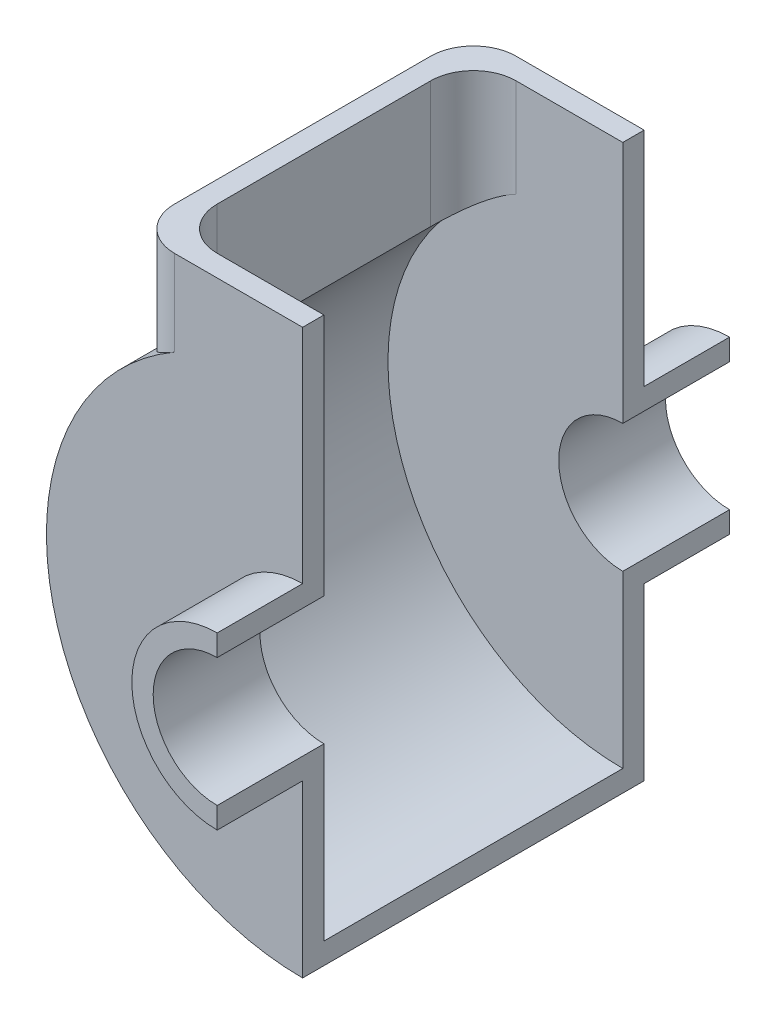
ISO-10303-21;
HEADER;
FILE_DESCRIPTION(('STEP AP214'),'2;1');
FILE_NAME('part.step','',(''),(''),'','','');
FILE_SCHEMA(('AUTOMOTIVE_DESIGN { 1 0 10303 214 1 1 1 1 }'));
ENDSEC;
DATA;
#1=APPLICATION_CONTEXT('core data for automotive mechanical design processes');
#2=APPLICATION_PROTOCOL_DEFINITION('international standard','automotive_design',2000,#1);
#3=PRODUCT_CONTEXT('',#1,'mechanical');
#4=PRODUCT('Part','Part','',(#3));
#5=PRODUCT_RELATED_PRODUCT_CATEGORY('part','',(#4));
#6=PRODUCT_DEFINITION_FORMATION('','',#4);
#7=PRODUCT_DEFINITION_CONTEXT('part definition',#1,'design');
#8=PRODUCT_DEFINITION('design','',#6,#7);
#9=PRODUCT_DEFINITION_SHAPE('','',#8);
#10=(LENGTH_UNIT() NAMED_UNIT(*) SI_UNIT(.MILLI.,.METRE.));
#11=(NAMED_UNIT(*) PLANE_ANGLE_UNIT() SI_UNIT($,.RADIAN.));
#12=(NAMED_UNIT(*) SI_UNIT($,.STERADIAN.) SOLID_ANGLE_UNIT());
#13=UNCERTAINTY_MEASURE_WITH_UNIT(LENGTH_MEASURE(1.E-05),#10,'distance_accuracy_value','');
#14=(GEOMETRIC_REPRESENTATION_CONTEXT(3) GLOBAL_UNCERTAINTY_ASSIGNED_CONTEXT((#13)) GLOBAL_UNIT_ASSIGNED_CONTEXT((#10,
#11,#12)) REPRESENTATION_CONTEXT('',''));
#15=CARTESIAN_POINT('',(0.,0.,0.));
#16=DIRECTION('',(0.,0.,1.));
#17=DIRECTION('',(1.,0.,0.));
#18=AXIS2_PLACEMENT_3D('',#15,#16,#17);
#19=CARTESIAN_POINT('',(0.,0.,0.));
#20=DIRECTION('',(0.,0.,1.));
#21=DIRECTION('',(1.,0.,0.));
#22=AXIS2_PLACEMENT_3D('',#19,#20,#21);
#23=PLANE('',#22);
#24=CARTESIAN_POINT('',(0.,0.,0.));
#25=DIRECTION('',(0.,0.,1.));
#26=DIRECTION('',(1.,0.,0.));
#27=AXIS2_PLACEMENT_3D('',#24,#25,#26);
#28=CIRCLE('',#27,55.);
#29=CARTESIAN_POINT('',(-25.,48.9897948556636,0.));
#30=VERTEX_POINT('',#29);
#31=CARTESIAN_POINT('',(0.,-55.,0.));
#32=VERTEX_POINT('',#31);
#33=EDGE_CURVE('E272',#30,#32,#28,.T.);
#34=ORIENTED_EDGE('',*,*,#33,.F.);
#35=DIRECTION('',(0.,-1.,0.));
#36=VECTOR('',#35,1.);
#37=CARTESIAN_POINT('',(-25.,72.,0.));
#38=LINE('',#37,#36);
#39=CARTESIAN_POINT('',(-25.,72.,0.));
#40=VERTEX_POINT('',#39);
#41=EDGE_CURVE('E366',#30,#40,#38,.F.);
#42=ORIENTED_EDGE('',*,*,#41,.T.);
#43=DIRECTION('',(1.,0.,0.));
#44=VECTOR('',#43,1.);
#45=CARTESIAN_POINT('',(0.,72.,0.));
#46=LINE('',#45,#44);
#47=CARTESIAN_POINT('',(0.,72.,0.));
#48=VERTEX_POINT('',#47);
#49=EDGE_CURVE('E285',#40,#48,#46,.T.);
#50=ORIENTED_EDGE('',*,*,#49,.T.);
#51=DIRECTION('',(0.,1.,0.));
#52=VECTOR('',#51,1.);
#53=CARTESIAN_POINT('',(0.,15.,0.));
#54=LINE('',#53,#52);
#55=CARTESIAN_POINT('',(0.,15.,0.));
#56=VERTEX_POINT('',#55);
#57=EDGE_CURVE('E312',#56,#48,#54,.T.);
#58=ORIENTED_EDGE('',*,*,#57,.F.);
#59=CARTESIAN_POINT('',(0.,0.,0.));
#60=DIRECTION('',(0.,0.,1.));
#61=DIRECTION('',(1.,0.,0.));
#62=AXIS2_PLACEMENT_3D('',#59,#60,#61);
#63=CIRCLE('',#62,15.);
#64=CARTESIAN_POINT('',(0.,-15.,0.));
#65=VERTEX_POINT('',#64);
#66=EDGE_CURVE('E323',#56,#65,#63,.T.);
#67=ORIENTED_EDGE('',*,*,#66,.T.);
#68=DIRECTION('',(0.,-1.,0.));
#69=VECTOR('',#68,1.);
#70=CARTESIAN_POINT('',(0.,-15.,0.));
#71=LINE('',#70,#69);
#72=EDGE_CURVE('E338',#65,#32,#71,.T.);
#73=ORIENTED_EDGE('',*,*,#72,.T.);
#74=EDGE_LOOP('',(#34,#42,#50,#58,#67,#73));
#75=FACE_BOUND('',#74,.T.);
#76=ADVANCED_FACE('F43',(#75),#23,.F.);
#77=CARTESIAN_POINT('',(0.,0.,25.));
#78=DIRECTION('',(0.,0.,-1.));
#79=DIRECTION('',(-1.,0.,0.));
#80=AXIS2_PLACEMENT_3D('',#77,#78,#79);
#81=CYLINDRICAL_SURFACE('',#80,20.);
#82=CARTESIAN_POINT('',(0.,0.,5.));
#83=DIRECTION('',(0.,0.,1.));
#84=DIRECTION('',(-1.,0.,0.));
#85=AXIS2_PLACEMENT_3D('',#82,#83,#84);
#86=CIRCLE('',#85,20.);
#87=CARTESIAN_POINT('',(0.,20.,5.));
#88=VERTEX_POINT('',#87);
#89=CARTESIAN_POINT('',(0.,-20.,5.));
#90=VERTEX_POINT('',#89);
#91=EDGE_CURVE('E293',#88,#90,#86,.T.);
#92=ORIENTED_EDGE('',*,*,#91,.T.);
#93=DIRECTION('',(0.,0.,-1.));
#94=VECTOR('',#93,1.);
#95=CARTESIAN_POINT('',(0.,-20.,25.));
#96=LINE('',#95,#94);
#97=CARTESIAN_POINT('',(0.,-20.,25.));
#98=VERTEX_POINT('',#97);
#99=EDGE_CURVE('E349',#98,#90,#96,.T.);
#100=ORIENTED_EDGE('',*,*,#99,.F.);
#101=CARTESIAN_POINT('',(0.,0.,25.));
#102=DIRECTION('',(0.,0.,1.));
#103=DIRECTION('',(1.,0.,0.));
#104=AXIS2_PLACEMENT_3D('',#101,#102,#103);
#105=CIRCLE('',#104,20.);
#106=CARTESIAN_POINT('',(0.,20.,25.));
#107=VERTEX_POINT('',#106);
#108=EDGE_CURVE('E322',#107,#98,#105,.T.);
#109=ORIENTED_EDGE('',*,*,#108,.F.);
#110=DIRECTION('',(0.,0.,-1.));
#111=VECTOR('',#110,1.);
#112=CARTESIAN_POINT('',(0.,20.,25.));
#113=LINE('',#112,#111);
#114=EDGE_CURVE('E352',#107,#88,#113,.T.);
#115=ORIENTED_EDGE('',*,*,#114,.T.);
#116=EDGE_LOOP('',(#92,#100,#109,#115));
#117=FACE_BOUND('',#116,.T.);
#118=ADVANCED_FACE('F447',(#117),#81,.T.);
#119=CARTESIAN_POINT('',(0.,15.,25.));
#120=DIRECTION('',(-1.,0.,0.));
#121=DIRECTION('',(0.,0.,1.));
#122=AXIS2_PLACEMENT_3D('',#119,#120,#121);
#123=PLANE('',#122);
#124=ORIENTED_EDGE('',*,*,#57,.T.);
#125=DIRECTION('',(0.,0.,-1.));
#126=VECTOR('',#125,1.);
#127=CARTESIAN_POINT('',(0.,72.,5.));
#128=LINE('',#127,#126);
#129=CARTESIAN_POINT('',(0.,72.,5.));
#130=VERTEX_POINT('',#129);
#131=EDGE_CURVE('E308',#130,#48,#128,.T.);
#132=ORIENTED_EDGE('',*,*,#131,.F.);
#133=DIRECTION('',(0.,-1.,0.));
#134=VECTOR('',#133,1.);
#135=CARTESIAN_POINT('',(0.,20.,5.));
#136=LINE('',#135,#134);
#137=EDGE_CURVE('E200',#130,#88,#136,.T.);
#138=ORIENTED_EDGE('',*,*,#137,.T.);
#139=ORIENTED_EDGE('',*,*,#114,.F.);
#140=DIRECTION('',(0.,1.,0.));
#141=VECTOR('',#140,1.);
#142=CARTESIAN_POINT('',(0.,15.,25.));
#143=LINE('',#142,#141);
#144=CARTESIAN_POINT('',(0.,15.,25.));
#145=VERTEX_POINT('',#144);
#146=EDGE_CURVE('E318',#145,#107,#143,.T.);
#147=ORIENTED_EDGE('',*,*,#146,.F.);
#148=DIRECTION('',(0.,0.,-1.));
#149=VECTOR('',#148,1.);
#150=CARTESIAN_POINT('',(0.,15.,25.));
#151=LINE('',#150,#149);
#152=EDGE_CURVE('E334',#145,#56,#151,.T.);
#153=ORIENTED_EDGE('',*,*,#152,.T.);
#154=EDGE_LOOP('',(#124,#132,#138,#139,#147,#153));
#155=FACE_BOUND('',#154,.T.);
#156=ADVANCED_FACE('F409',(#155),#123,.F.);
#157=CARTESIAN_POINT('',(0.,-15.,25.));
#158=DIRECTION('',(1.,0.,0.));
#159=DIRECTION('',(0.,0.,-1.));
#160=AXIS2_PLACEMENT_3D('',#157,#158,#159);
#161=PLANE('',#160);
#162=ORIENTED_EDGE('',*,*,#72,.F.);
#163=DIRECTION('',(0.,0.,-1.));
#164=VECTOR('',#163,1.);
#165=CARTESIAN_POINT('',(0.,-15.,25.));
#166=LINE('',#165,#164);
#167=CARTESIAN_POINT('',(0.,-15.,25.));
#168=VERTEX_POINT('',#167);
#169=EDGE_CURVE('E346',#168,#65,#166,.T.);
#170=ORIENTED_EDGE('',*,*,#169,.F.);
#171=DIRECTION('',(0.,-1.,0.));
#172=VECTOR('',#171,1.);
#173=CARTESIAN_POINT('',(0.,-15.,25.));
#174=LINE('',#173,#172);
#175=EDGE_CURVE('E326',#168,#98,#174,.T.);
#176=ORIENTED_EDGE('',*,*,#175,.T.);
#177=ORIENTED_EDGE('',*,*,#99,.T.);
#178=DIRECTION('',(0.,-1.,0.));
#179=VECTOR('',#178,1.);
#180=CARTESIAN_POINT('',(0.,-20.,5.));
#181=LINE('',#180,#179);
#182=CARTESIAN_POINT('',(0.,-60.,5.));
#183=VERTEX_POINT('',#182);
#184=EDGE_CURVE('E197',#90,#183,#181,.T.);
#185=ORIENTED_EDGE('',*,*,#184,.T.);
#186=DIRECTION('',(0.,0.,-1.));
#187=VECTOR('',#186,1.);
#188=CARTESIAN_POINT('',(0.,-60.,5.));
#189=LINE('',#188,#187);
#190=CARTESIAN_POINT('',(0.,-60.,-75.));
#191=VERTEX_POINT('',#190);
#192=EDGE_CURVE('E187',#183,#191,#189,.T.);
#193=ORIENTED_EDGE('',*,*,#192,.T.);
#194=DIRECTION('',(0.,-1.,0.));
#195=VECTOR('',#194,1.);
#196=CARTESIAN_POINT('',(0.,-20.,-75.));
#197=LINE('',#196,#195);
#198=CARTESIAN_POINT('',(0.,-20.,-75.));
#199=VERTEX_POINT('',#198);
#200=EDGE_CURVE('E193',#199,#191,#197,.T.);
#201=ORIENTED_EDGE('',*,*,#200,.F.);
#202=DIRECTION('',(0.,0.,1.));
#203=VECTOR('',#202,1.);
#204=CARTESIAN_POINT('',(0.,-20.,-95.));
#205=LINE('',#204,#203);
#206=CARTESIAN_POINT('',(0.,-20.,-95.));
#207=VERTEX_POINT('',#206);
#208=EDGE_CURVE('E265',#207,#199,#205,.T.);
#209=ORIENTED_EDGE('',*,*,#208,.F.);
#210=DIRECTION('',(0.,-1.,0.));
#211=VECTOR('',#210,1.);
#212=CARTESIAN_POINT('',(0.,-15.,-95.));
#213=LINE('',#212,#211);
#214=CARTESIAN_POINT('',(0.,-15.,-95.));
#215=VERTEX_POINT('',#214);
#216=EDGE_CURVE('E242',#215,#207,#213,.T.);
#217=ORIENTED_EDGE('',*,*,#216,.F.);
#218=DIRECTION('',(0.,0.,1.));
#219=VECTOR('',#218,1.);
#220=CARTESIAN_POINT('',(0.,-15.,-95.));
#221=LINE('',#220,#219);
#222=CARTESIAN_POINT('',(0.,-15.,-70.));
#223=VERTEX_POINT('',#222);
#224=EDGE_CURVE('E261',#215,#223,#221,.T.);
#225=ORIENTED_EDGE('',*,*,#224,.T.);
#226=DIRECTION('',(0.,-1.,0.));
#227=VECTOR('',#226,1.);
#228=CARTESIAN_POINT('',(0.,-15.,-70.));
#229=LINE('',#228,#227);
#230=CARTESIAN_POINT('',(0.,-55.,-70.));
#231=VERTEX_POINT('',#230);
#232=EDGE_CURVE('E252',#223,#231,#229,.T.);
#233=ORIENTED_EDGE('',*,*,#232,.T.);
#234=DIRECTION('',(0.,0.,1.));
#235=VECTOR('',#234,1.);
#236=CARTESIAN_POINT('',(0.,-55.,-70.));
#237=LINE('',#236,#235);
#238=EDGE_CURVE('E277',#231,#32,#237,.T.);
#239=ORIENTED_EDGE('',*,*,#238,.T.);
#240=EDGE_LOOP('',(#162,#170,#176,#177,#185,#193,#201,#209,#217,#225,#233,#239));
#241=FACE_BOUND('',#240,.T.);
#242=ADVANCED_FACE('F190',(#241),#161,.T.);
#243=CARTESIAN_POINT('',(0.,0.,25.));
#244=DIRECTION('',(0.,0.,-1.));
#245=DIRECTION('',(-1.,0.,0.));
#246=AXIS2_PLACEMENT_3D('',#243,#244,#245);
#247=CYLINDRICAL_SURFACE('',#246,15.);
#248=ORIENTED_EDGE('',*,*,#66,.F.);
#249=ORIENTED_EDGE('',*,*,#152,.F.);
#250=CARTESIAN_POINT('',(0.,0.,25.));
#251=DIRECTION('',(0.,0.,1.));
#252=DIRECTION('',(1.,0.,0.));
#253=AXIS2_PLACEMENT_3D('',#250,#251,#252);
#254=CIRCLE('',#253,15.);
#255=EDGE_CURVE('E330',#145,#168,#254,.T.);
#256=ORIENTED_EDGE('',*,*,#255,.T.);
#257=ORIENTED_EDGE('',*,*,#169,.T.);
#258=EDGE_LOOP('',(#248,#249,#256,#257));
#259=FACE_BOUND('',#258,.T.);
#260=ADVANCED_FACE('F443',(#259),#247,.F.);
#261=CARTESIAN_POINT('',(0.,0.,25.));
#262=DIRECTION('',(0.,0.,1.));
#263=DIRECTION('',(1.,0.,0.));
#264=AXIS2_PLACEMENT_3D('',#261,#262,#263);
#265=PLANE('',#264);
#266=ORIENTED_EDGE('',*,*,#146,.T.);
#267=ORIENTED_EDGE('',*,*,#108,.T.);
#268=ORIENTED_EDGE('',*,*,#175,.F.);
#269=ORIENTED_EDGE('',*,*,#255,.F.);
#270=EDGE_LOOP('',(#266,#267,#268,#269));
#271=FACE_BOUND('',#270,.T.);
#272=ADVANCED_FACE('F438',(#271),#265,.T.);
#273=CARTESIAN_POINT('',(0.,72.,5.));
#274=DIRECTION('',(0.,1.,0.));
#275=DIRECTION('',(0.,0.,1.));
#276=AXIS2_PLACEMENT_3D('',#273,#274,#275);
#277=PLANE('',#276);
#278=DIRECTION('',(1.,0.,0.));
#279=VECTOR('',#278,1.);
#280=CARTESIAN_POINT('',(0.,72.,-75.));
#281=LINE('',#280,#279);
#282=CARTESIAN_POINT('',(-30.,72.,-75.));
#283=VERTEX_POINT('',#282);
#284=CARTESIAN_POINT('',(0.,72.,-75.));
#285=VERTEX_POINT('',#284);
#286=EDGE_CURVE('E210',#283,#285,#281,.T.);
#287=ORIENTED_EDGE('',*,*,#286,.F.);
#288=CARTESIAN_POINT('',(-30.,72.,-65.));
#289=DIRECTION('',(0.,1.,0.));
#290=DIRECTION('',(0.,0.,1.));
#291=AXIS2_PLACEMENT_3D('',#288,#289,#290);
#292=CIRCLE('',#291,10.);
#293=CARTESIAN_POINT('',(-40.,72.,-65.));
#294=VERTEX_POINT('',#293);
#295=EDGE_CURVE('E375',#283,#294,#292,.T.);
#296=ORIENTED_EDGE('',*,*,#295,.T.);
#297=DIRECTION('',(0.,0.,-1.));
#298=VECTOR('',#297,1.);
#299=CARTESIAN_POINT('',(-40.,72.,5.));
#300=LINE('',#299,#298);
#301=CARTESIAN_POINT('',(-40.,72.,-5.));
#302=VERTEX_POINT('',#301);
#303=EDGE_CURVE('E313',#302,#294,#300,.T.);
#304=ORIENTED_EDGE('',*,*,#303,.F.);
#305=CARTESIAN_POINT('',(-30.,72.,-5.));
#306=DIRECTION('',(0.,1.,0.));
#307=DIRECTION('',(0.,0.,1.));
#308=AXIS2_PLACEMENT_3D('',#305,#306,#307);
#309=CIRCLE('',#308,10.);
#310=CARTESIAN_POINT('',(-30.,72.,5.));
#311=VERTEX_POINT('',#310);
#312=EDGE_CURVE('E372',#302,#311,#309,.T.);
#313=ORIENTED_EDGE('',*,*,#312,.T.);
#314=DIRECTION('',(1.,0.,0.));
#315=VECTOR('',#314,1.);
#316=CARTESIAN_POINT('',(0.,72.,5.));
#317=LINE('',#316,#315);
#318=EDGE_CURVE('E300',#311,#130,#317,.T.);
#319=ORIENTED_EDGE('',*,*,#318,.T.);
#320=ORIENTED_EDGE('',*,*,#131,.T.);
#321=ORIENTED_EDGE('',*,*,#49,.F.);
#322=CARTESIAN_POINT('',(-25.,72.,-10.));
#323=DIRECTION('',(0.,1.,0.));
#324=DIRECTION('',(0.,0.,1.));
#325=AXIS2_PLACEMENT_3D('',#322,#323,#324);
#326=CIRCLE('',#325,10.);
#327=CARTESIAN_POINT('',(-35.,72.,-10.));
#328=VERTEX_POINT('',#327);
#329=EDGE_CURVE('E424',#40,#328,#326,.F.);
#330=ORIENTED_EDGE('',*,*,#329,.T.);
#331=DIRECTION('',(0.,0.,1.));
#332=VECTOR('',#331,1.);
#333=CARTESIAN_POINT('',(-35.,72.,-70.));
#334=LINE('',#333,#332);
#335=CARTESIAN_POINT('',(-35.,72.,-60.));
#336=VERTEX_POINT('',#335);
#337=EDGE_CURVE('E281',#336,#328,#334,.T.);
#338=ORIENTED_EDGE('',*,*,#337,.F.);
#339=CARTESIAN_POINT('',(-25.,72.,-60.));
#340=DIRECTION('',(0.,1.,0.));
#341=DIRECTION('',(0.,0.,1.));
#342=AXIS2_PLACEMENT_3D('',#339,#340,#341);
#343=CIRCLE('',#342,10.);
#344=CARTESIAN_POINT('',(-25.,72.,-70.));
#345=VERTEX_POINT('',#344);
#346=EDGE_CURVE('E396',#336,#345,#343,.F.);
#347=ORIENTED_EDGE('',*,*,#346,.T.);
#348=DIRECTION('',(1.,0.,0.));
#349=VECTOR('',#348,1.);
#350=CARTESIAN_POINT('',(0.,72.,-70.));
#351=LINE('',#350,#349);
#352=CARTESIAN_POINT('',(0.,72.,-70.));
#353=VERTEX_POINT('',#352);
#354=EDGE_CURVE('E219',#345,#353,#351,.T.);
#355=ORIENTED_EDGE('',*,*,#354,.T.);
#356=DIRECTION('',(0.,0.,1.));
#357=VECTOR('',#356,1.);
#358=CARTESIAN_POINT('',(0.,72.,-75.));
#359=LINE('',#358,#357);
#360=EDGE_CURVE('E227',#285,#353,#359,.T.);
#361=ORIENTED_EDGE('',*,*,#360,.F.);
#362=EDGE_LOOP('',(#287,#296,#304,#313,#319,#320,#321,#330,#338,#347,#355,#361));
#363=FACE_BOUND('',#362,.T.);
#364=ADVANCED_FACE('F442',(#363),#277,.T.);
#365=CARTESIAN_POINT('',(-40.,72.,5.));
#366=DIRECTION('',(-1.,0.,0.));
#367=DIRECTION('',(0.,0.,1.));
#368=AXIS2_PLACEMENT_3D('',#365,#366,#367);
#369=PLANE('',#368);
#370=ORIENTED_EDGE('',*,*,#303,.T.);
#371=DIRECTION('',(0.,1.,0.));
#372=VECTOR('',#371,1.);
#373=CARTESIAN_POINT('',(-40.,44.7213595499958,-65.));
#374=LINE('',#373,#372);
#375=CARTESIAN_POINT('',(-40.,44.7213595499958,-65.));
#376=VERTEX_POINT('',#375);
#377=EDGE_CURVE('E72',#294,#376,#374,.F.);
#378=ORIENTED_EDGE('',*,*,#377,.T.);
#379=DIRECTION('',(0.,0.,-1.));
#380=VECTOR('',#379,1.);
#381=CARTESIAN_POINT('',(-40.,44.7213595499958,5.));
#382=LINE('',#381,#380);
#383=CARTESIAN_POINT('',(-40.,44.7213595499958,-5.));
#384=VERTEX_POINT('',#383);
#385=EDGE_CURVE('E199',#384,#376,#382,.T.);
#386=ORIENTED_EDGE('',*,*,#385,.F.);
#387=DIRECTION('',(0.,1.,0.));
#388=VECTOR('',#387,1.);
#389=CARTESIAN_POINT('',(-40.,72.,-5.));
#390=LINE('',#389,#388);
#391=EDGE_CURVE('E378',#384,#302,#390,.T.);
#392=ORIENTED_EDGE('',*,*,#391,.T.);
#393=EDGE_LOOP('',(#370,#378,#386,#392));
#394=FACE_BOUND('',#393,.T.);
#395=ADVANCED_FACE('F436',(#394),#369,.T.);
#396=CARTESIAN_POINT('',(0.,0.,5.));
#397=DIRECTION('',(0.,0.,-1.));
#398=DIRECTION('',(-1.,0.,0.));
#399=AXIS2_PLACEMENT_3D('',#396,#397,#398);
#400=CYLINDRICAL_SURFACE('',#399,60.);
#401=CARTESIAN_POINT('',(0.,0.,5.));
#402=DIRECTION('',(0.,0.,-1.));
#403=DIRECTION('',(-1.,0.,0.));
#404=AXIS2_PLACEMENT_3D('',#401,#402,#403);
#405=CIRCLE('',#404,60.);
#406=CARTESIAN_POINT('',(-30.,51.9615242270663,5.));
#407=VERTEX_POINT('',#406);
#408=EDGE_CURVE('E64',#183,#407,#405,.T.);
#409=ORIENTED_EDGE('',*,*,#408,.T.);
#410=CARTESIAN_POINT('',(-30.,51.9615242270663,5.));
#411=CARTESIAN_POINT('',(-30.1846403402756,51.8549243575684,4.99999694467445));
#412=CARTESIAN_POINT('',(-30.3686755821332,51.7473565843307,4.99488587812623));
#413=CARTESIAN_POINT('',(-30.7351668388072,51.5305231450817,4.97462918627216));
#414=CARTESIAN_POINT('',(-30.9176229894396,51.4212576273974,4.95948443281986));
#415=CARTESIAN_POINT('',(-31.4619253243051,51.0913595980358,4.89929167200636));
#416=CARTESIAN_POINT('',(-31.8209014856786,50.868512343648,4.83948477245505));
#417=CARTESIAN_POINT('',(-32.5288887310146,50.418725257113,4.68176841927459));
#418=CARTESIAN_POINT('',(-32.8778736192083,50.1917768316845,4.5837671788936));
#419=CARTESIAN_POINT('',(-33.562476910193,49.7365966241752,4.35090696893926));
#420=CARTESIAN_POINT('',(-33.8980954977704,49.5083648598862,4.21604850911225));
#421=CARTESIAN_POINT('',(-34.5207296024579,49.0759439346811,3.92574534472068));
#422=CARTESIAN_POINT('',(-34.8092512536601,48.8716304811259,3.77370267176126));
#423=CARTESIAN_POINT('',(-35.3716903107987,48.4661085573826,3.44107089228342));
#424=CARTESIAN_POINT('',(-35.6456079007732,48.2649000480893,3.26048214561176));
#425=CARTESIAN_POINT('',(-36.1765727574088,47.8682074936152,2.87135112309205));
#426=CARTESIAN_POINT('',(-36.4336405194033,47.6727166603459,2.66284378257167));
#427=CARTESIAN_POINT('',(-36.9290721152615,47.289972828363,2.21794621899144));
#428=CARTESIAN_POINT('',(-37.167441451851,47.1027174132443,1.98156425075618));
#429=CARTESIAN_POINT('',(-37.565018182153,46.785859634165,1.54478146403292));
#430=CARTESIAN_POINT('',(-37.7289458526818,46.6537017113221,1.35050833176437));
#431=CARTESIAN_POINT('',(-38.0437650386959,46.397339573439,0.946710505836691));
#432=CARTESIAN_POINT('',(-38.1946575996422,46.2731347207424,0.737187037795451));
#433=CARTESIAN_POINT('',(-38.4818360085844,46.0345861261904,0.303399948510743));
#434=CARTESIAN_POINT('',(-38.618136880254,45.9202322658759,0.0791518792914404));
#435=CARTESIAN_POINT('',(-38.8746918035924,45.7032445431668,-0.383743447816962));
#436=CARTESIAN_POINT('',(-38.9949492411763,45.6006082084878,-0.62238765196006));
#437=CARTESIAN_POINT('',(-39.1965662504922,45.4273417305266,-1.06669402634214));
#438=CARTESIAN_POINT('',(-39.2809795718102,45.3543309967536,-1.27004581930021));
#439=CARTESIAN_POINT('',(-39.437114382813,45.2186323209963,-1.68488791321454));
#440=CARTESIAN_POINT('',(-39.508838494378,45.1559422467147,-1.89637652189831));
#441=CARTESIAN_POINT('',(-39.6385128100447,45.0421551914612,-2.32617263610176));
#442=CARTESIAN_POINT('',(-39.6964869139818,44.9910381018204,-2.54446755239788));
#443=CARTESIAN_POINT('',(-39.7978943535571,44.9013606141582,-2.98685266600599));
#444=CARTESIAN_POINT('',(-39.8413328734582,44.8627957393971,-3.21094076633609));
#445=CARTESIAN_POINT('',(-39.9177189665931,44.7948514731765,-3.6937744282411));
#446=CARTESIAN_POINT('',(-39.9484884415043,44.7673886419263,-3.95314914513774));
#447=CARTESIAN_POINT('',(-39.9793476433001,44.7398248250479,-4.34440444684135));
#448=CARTESIAN_POINT('',(-39.987084921451,44.7329085695169,-4.47527578752073));
#449=CARTESIAN_POINT('',(-39.9974129661721,44.7236736235071,-4.73742237599204));
#450=CARTESIAN_POINT('',(-40.0000021863485,44.7213563144782,-4.86869773328782));
#451=CARTESIAN_POINT('',(-40.,44.7213595499958,-5.));
#452=B_SPLINE_CURVE_WITH_KNOTS('',3,(#410,#411,#412,#413,#414,#415,#416,#417,#418,#419,#420,
#421,#422,#423,#424,#425,#426,#427,#428,#429,#430,#431,#432,#433,#434,#435,#436,#437,#438,#439,
#440,#441,#442,#443,#444,#445,#446,#447,#448,#449,#450,#451),.UNSPECIFIED.,.F.,.F.,(4,2,2,2,2,2,
2,2,2,2,2,2,2,2,2,2,2,2,2,2,4),(0.,0.639469988122809,1.27888441829631,2.5570367234409,
3.83827975129429,5.11950506007103,6.27274736359202,7.42597513070352,8.5777730871098,
9.72923080131073,10.5879927572485,11.4466857734357,12.3044859953459,13.1621048939207,
13.8573439066469,14.5524390989254,15.2463170957639,15.9399473495783,16.7262834977137,
17.1199731890566,17.5137811205932),.UNSPECIFIED.);
#453=EDGE_CURVE('E11',#407,#384,#452,.T.);
#454=ORIENTED_EDGE('',*,*,#453,.T.);
#455=ORIENTED_EDGE('',*,*,#385,.T.);
#456=CARTESIAN_POINT('',(-40.,44.7213595499958,-65.));
#457=CARTESIAN_POINT('',(-40.0000015812733,44.7213573011344,-65.1176634010021));
#458=CARTESIAN_POINT('',(-39.9979227141808,44.7232176305845,-65.2353086549857));
#459=CARTESIAN_POINT('',(-39.9896253110866,44.7306372942271,-65.4703286016599));
#460=CARTESIAN_POINT('',(-39.9834070494192,44.7361963832882,-65.5877033117632));
#461=CARTESIAN_POINT('',(-39.9585923280535,44.7583670958171,-65.9388427467587));
#462=CARTESIAN_POINT('',(-39.9338358355778,44.7804722797486,-66.1718758054602));
#463=CARTESIAN_POINT('',(-39.8686644525486,44.8385042167555,-66.6318691326489));
#464=CARTESIAN_POINT('',(-39.8283855148164,44.8743109465834,-66.8588643223737));
#465=CARTESIAN_POINT('',(-39.7328892662281,44.9588875680342,-67.3072524479117));
#466=CARTESIAN_POINT('',(-39.6776696039361,45.0076595001554,-67.5286444958756));
#467=CARTESIAN_POINT('',(-39.5534118644793,45.116897250534,-67.9636688649734));
#468=CARTESIAN_POINT('',(-39.4844211995899,45.1773229225701,-68.1773249178853));
#469=CARTESIAN_POINT('',(-39.3334605195833,45.3088170177995,-68.5966936542645));
#470=CARTESIAN_POINT('',(-39.2514857085459,45.3798893730022,-68.8024033675523));
#471=CARTESIAN_POINT('',(-39.0753863002099,45.5316122169458,-69.2054529377369));
#472=CARTESIAN_POINT('',(-38.9812363061758,45.6122826978885,-69.4027741200324));
#473=CARTESIAN_POINT('',(-38.7818943790383,45.7818938454653,-69.788046749896));
#474=CARTESIAN_POINT('',(-38.6767013504078,45.8708353325264,-69.9759972651116));
#475=CARTESIAN_POINT('',(-38.4135728743112,46.0916172160901,-70.4129070483267));
#476=CARTESIAN_POINT('',(-38.2509572804995,46.2267600621542,-70.6573967975822));
#477=CARTESIAN_POINT('',(-37.908447036405,46.5080507377658,-71.1270697633622));
#478=CARTESIAN_POINT('',(-37.7285517130429,46.6541989959475,-71.3522522271834));
#479=CARTESIAN_POINT('',(-37.3531054007839,46.9553345195759,-71.783333742699));
#480=CARTESIAN_POINT('',(-37.1575367002328,47.1103317262239,-71.9892103913973));
#481=CARTESIAN_POINT('',(-36.7525951751676,47.4269223387039,-72.3811838692743));
#482=CARTESIAN_POINT('',(-36.5432234671629,47.5885152106185,-72.5672822951176));
#483=CARTESIAN_POINT('',(-35.889352420626,48.0859277319981,-73.1015951815724));
#484=CARTESIAN_POINT('',(-35.4251261289153,48.429498559668,-73.4189829871174));
#485=CARTESIAN_POINT('',(-34.4553726874119,49.1241578823887,-73.9699716496598));
#486=CARTESIAN_POINT('',(-33.9498747171002,49.4752409388269,-74.2036310842669));
#487=CARTESIAN_POINT('',(-33.1568278633415,50.0073212539565,-74.4930456878643));
#488=CARTESIAN_POINT('',(-32.8810021018505,50.1891501210001,-74.5803819665683));
#489=CARTESIAN_POINT('',(-32.3217375725054,50.5511235483305,-74.7310524671282));
#490=CARTESIAN_POINT('',(-32.0382991780871,50.7312681906542,-74.7943878640466));
#491=CARTESIAN_POINT('',(-31.4650006560554,51.0888227050653,-74.8963939978526));
#492=CARTESIAN_POINT('',(-31.1751356203563,51.2662302982853,-74.935045161166));
#493=CARTESIAN_POINT('',(-30.5906934832528,51.6171131325133,-74.9868485137105));
#494=CARTESIAN_POINT('',(-30.2961152167169,51.7905873747387,-74.9999942965489));
#495=CARTESIAN_POINT('',(-30.,51.9615242270663,-75.));
#496=B_SPLINE_CURVE_WITH_KNOTS('',3,(#456,#457,#458,#459,#460,#461,#462,#463,#464,#465,#466,
#467,#468,#469,#470,#471,#472,#473,#474,#475,#476,#477,#478,#479,#480,#481,#482,#483,#484,#485,
#486,#487,#488,#489,#490,#491,#492,#493,#494,#495),.UNSPECIFIED.,.F.,.F.,(4,2,2,2,2,2,2,2,2,2,2,
2,2,2,2,2,2,2,2,4),(0.,0.352921378883185,0.705819370583172,1.41085932128629,2.10985961734753,
2.80896998914977,3.50571366437716,4.20271529673452,4.90119502233958,5.59974410640154,
6.56805788163331,7.536409389878,8.50587104319845,9.47525437387455,11.4447404103531,
13.4128458625583,14.4372042618812,15.4615125030147,16.4866319729198,17.5120088970541),.UNSPECIFIED.);
#497=CARTESIAN_POINT('',(-30.,51.9615242270663,-75.));
#498=VERTEX_POINT('',#497);
#499=EDGE_CURVE('E58',#376,#498,#496,.T.);
#500=ORIENTED_EDGE('',*,*,#499,.T.);
#501=CARTESIAN_POINT('',(0.,0.,-75.));
#502=DIRECTION('',(0.,0.,-1.));
#503=DIRECTION('',(-1.,0.,0.));
#504=AXIS2_PLACEMENT_3D('',#501,#502,#503);
#505=CIRCLE('',#504,60.);
#506=EDGE_CURVE('E203',#191,#498,#505,.T.);
#507=ORIENTED_EDGE('',*,*,#506,.F.);
#508=ORIENTED_EDGE('',*,*,#192,.F.);
#509=EDGE_LOOP('',(#409,#454,#455,#500,#507,#508));
#510=FACE_BOUND('',#509,.T.);
#511=ADVANCED_FACE('F204',(#510),#400,.T.);
#512=CARTESIAN_POINT('',(0.,0.,5.));
#513=DIRECTION('',(0.,0.,-1.));
#514=DIRECTION('',(-1.,0.,0.));
#515=AXIS2_PLACEMENT_3D('',#512,#513,#514);
#516=PLANE('',#515);
#517=ORIENTED_EDGE('',*,*,#318,.F.);
#518=DIRECTION('',(0.,1.,0.));
#519=VECTOR('',#518,1.);
#520=CARTESIAN_POINT('',(-30.,44.7213595499958,5.));
#521=LINE('',#520,#519);
#522=EDGE_CURVE('E384',#311,#407,#521,.F.);
#523=ORIENTED_EDGE('',*,*,#522,.T.);
#524=ORIENTED_EDGE('',*,*,#408,.F.);
#525=ORIENTED_EDGE('',*,*,#184,.F.);
#526=ORIENTED_EDGE('',*,*,#91,.F.);
#527=ORIENTED_EDGE('',*,*,#137,.F.);
#528=EDGE_LOOP('',(#517,#523,#524,#525,#526,#527));
#529=FACE_BOUND('',#528,.T.);
#530=ADVANCED_FACE('F435',(#529),#516,.F.);
#531=CARTESIAN_POINT('',(-35.,44.7213595499958,-70.));
#532=DIRECTION('',(-1.,0.,0.));
#533=DIRECTION('',(0.,0.,1.));
#534=AXIS2_PLACEMENT_3D('',#531,#532,#533);
#535=PLANE('',#534);
#536=DIRECTION('',(0.,0.,1.));
#537=VECTOR('',#536,1.);
#538=CARTESIAN_POINT('',(-35.,42.4264068711928,-70.));
#539=LINE('',#538,#537);
#540=CARTESIAN_POINT('',(-35.,42.4264068711928,-60.));
#541=VERTEX_POINT('',#540);
#542=CARTESIAN_POINT('',(-35.,42.4264068711928,-10.));
#543=VERTEX_POINT('',#542);
#544=EDGE_CURVE('E286',#541,#543,#539,.T.);
#545=ORIENTED_EDGE('',*,*,#544,.F.);
#546=DIRECTION('',(0.,-1.,0.));
#547=VECTOR('',#546,1.);
#548=CARTESIAN_POINT('',(-35.,72.,-60.));
#549=LINE('',#548,#547);
#550=EDGE_CURVE('E363',#541,#336,#549,.F.);
#551=ORIENTED_EDGE('',*,*,#550,.T.);
#552=ORIENTED_EDGE('',*,*,#337,.T.);
#553=DIRECTION('',(0.,-1.,0.));
#554=VECTOR('',#553,1.);
#555=CARTESIAN_POINT('',(-35.,42.4264068711928,-10.));
#556=LINE('',#555,#554);
#557=EDGE_CURVE('E359',#328,#543,#556,.T.);
#558=ORIENTED_EDGE('',*,*,#557,.T.);
#559=EDGE_LOOP('',(#545,#551,#552,#558));
#560=FACE_BOUND('',#559,.T.);
#561=ADVANCED_FACE('F509',(#560),#535,.F.);
#562=CARTESIAN_POINT('',(0.,0.,-70.));
#563=DIRECTION('',(0.,0.,1.));
#564=DIRECTION('',(1.,0.,0.));
#565=AXIS2_PLACEMENT_3D('',#562,#563,#564);
#566=CYLINDRICAL_SURFACE('',#565,55.);
#567=ORIENTED_EDGE('',*,*,#33,.T.);
#568=ORIENTED_EDGE('',*,*,#238,.F.);
#569=CARTESIAN_POINT('',(0.,0.,-70.));
#570=DIRECTION('',(0.,0.,1.));
#571=DIRECTION('',(1.,0.,0.));
#572=AXIS2_PLACEMENT_3D('',#569,#570,#571);
#573=CIRCLE('',#572,55.);
#574=CARTESIAN_POINT('',(-25.,48.9897948556636,-70.));
#575=VERTEX_POINT('',#574);
#576=EDGE_CURVE('E273',#575,#231,#573,.T.);
#577=ORIENTED_EDGE('',*,*,#576,.F.);
#578=CARTESIAN_POINT('',(-25.,48.9897948556636,-70.));
#579=CARTESIAN_POINT('',(-25.1906704625853,48.8924964907343,-69.9999971656189));
#580=CARTESIAN_POINT('',(-25.3807299051036,48.7941008127997,-69.9945462068009));
#581=CARTESIAN_POINT('',(-25.7591946792121,48.5953653194177,-69.9729416657178));
#582=CARTESIAN_POINT('',(-25.947600172291,48.4950256969118,-69.9567891403815));
#583=CARTESIAN_POINT('',(-26.5095199627771,48.1915584402701,-69.8925935595296));
#584=CARTESIAN_POINT('',(-26.879966617226,47.985865462464,-69.8288120264318));
#585=CARTESIAN_POINT('',(-27.6092367230561,47.5700172433392,-69.6608532752705));
#586=CARTESIAN_POINT('',(-27.9680515865194,47.3598588865119,-69.5566469152987));
#587=CARTESIAN_POINT('',(-28.6708870947942,46.9377053718885,-69.3093143170567));
#588=CARTESIAN_POINT('',(-29.0149087495746,46.7257103406777,-69.1661907406623));
#589=CARTESIAN_POINT('',(-29.6343122240442,46.3348745882726,-68.8669502099571));
#590=CARTESIAN_POINT('',(-29.9121762835488,46.1558947290866,-68.7161192793689));
#591=CARTESIAN_POINT('',(-30.453564058984,45.8004938086764,-68.3880155176435));
#592=CARTESIAN_POINT('',(-30.7170889667725,45.6240725356815,-68.210744888747));
#593=CARTESIAN_POINT('',(-31.2277793899634,45.27605554075,-67.8304558145634));
#594=CARTESIAN_POINT('',(-31.4749603097885,45.1044553652141,-67.6274621555615));
#595=CARTESIAN_POINT('',(-31.9512644556701,44.7683103206218,-67.1960491883292));
#596=CARTESIAN_POINT('',(-32.1803914213147,44.60376399371,-66.9676351692916));
#597=CARTESIAN_POINT('',(-32.5724334975713,44.3179704705642,-66.536394282226));
#598=CARTESIAN_POINT('',(-32.7391594522469,44.1948776144083,-66.3382416976568));
#599=CARTESIAN_POINT('',(-33.0586989979014,43.956366411861,-65.9266540781595));
#600=CARTESIAN_POINT('',(-33.2115135789464,43.8409475194751,-65.7132201327334));
#601=CARTESIAN_POINT('',(-33.5016809731427,43.6196131502261,-65.2717299317311));
#602=CARTESIAN_POINT('',(-33.6390478315194,43.5136890586718,-65.0436872596241));
#603=CARTESIAN_POINT('',(-33.8968966266417,43.3131282626193,-64.5735187782177));
#604=CARTESIAN_POINT('',(-34.0173818752135,43.2184893447453,-64.3313957444228));
#605=CARTESIAN_POINT('',(-34.220345560487,43.0578872759331,-63.8775967975981));
#606=CARTESIAN_POINT('',(-34.3057864350373,42.9898029979803,-63.6679931294044));
#607=CARTESIAN_POINT('',(-34.4630420236251,42.8638412603264,-63.2407750890927));
#608=CARTESIAN_POINT('',(-34.534859392632,42.805961812048,-63.023162287697));
#609=CARTESIAN_POINT('',(-34.6638213670323,42.7015968076424,-62.5813588577465));
#610=CARTESIAN_POINT('',(-34.7209903361364,42.6550923381947,-62.357179851681));
#611=CARTESIAN_POINT('',(-34.8199345283325,42.5743613090907,-61.9033665270967));
#612=CARTESIAN_POINT('',(-34.8617157478199,42.5401299669028,-61.6737343708085));
#613=CARTESIAN_POINT('',(-34.9300837462733,42.4840120509156,-61.2045822520297));
#614=CARTESIAN_POINT('',(-34.9562545186649,42.4624636500731,-60.9649596154708));
#615=CARTESIAN_POINT('',(-34.9824752970613,42.4408592306511,-60.6039690758757));
#616=CARTESIAN_POINT('',(-34.9890430057937,42.4354441063026,-60.4833431270819));
#617=CARTESIAN_POINT('',(-34.9978062165354,42.4282167617888,-60.241817657905));
#618=CARTESIAN_POINT('',(-35.0000014553635,42.4264047584974,-60.120918121493));
#619=CARTESIAN_POINT('',(-35.,42.4264068711928,-60.));
#620=B_SPLINE_CURVE_WITH_KNOTS('',3,(#578,#579,#580,#581,#582,#583,#584,#585,#586,#587,#588,
#589,#590,#591,#592,#593,#594,#595,#596,#597,#598,#599,#600,#601,#602,#603,#604,#605,#606,#607,
#608,#609,#610,#611,#612,#613,#614,#615,#616,#617,#618,#619),.UNSPECIFIED.,.F.,.F.,(4,2,2,2,2,2,
2,2,2,2,2,2,2,2,2,2,2,2,2,2,4),(0.,0.642025153546947,1.28398690760974,2.56714249695266,
3.85122482619341,5.13521934832298,6.22394893506149,7.31258788888127,8.40018571330232,
9.4875576637522,10.3469757139952,11.2063325519534,12.0649016266237,12.9233020310802,
13.6317123054177,14.3399843815419,15.0470706749441,15.7538811342204,16.4787715527391,
16.8414339261366,17.2041181277167),.UNSPECIFIED.);
#621=EDGE_CURVE('E387',#575,#541,#620,.T.);
#622=ORIENTED_EDGE('',*,*,#621,.T.);
#623=ORIENTED_EDGE('',*,*,#544,.T.);
#624=CARTESIAN_POINT('',(-35.,42.4264068711928,-10.));
#625=CARTESIAN_POINT('',(-35.0000014497964,42.4264047837681,-9.8798731031572));
#626=CARTESIAN_POINT('',(-34.9978348514331,42.4281931348836,-9.75976422715494));
#627=CARTESIAN_POINT('',(-34.9891857816154,42.4353263709232,-9.51981491367696));
#628=CARTESIAN_POINT('',(-34.9827035721487,42.4406710399539,-9.3999744603492));
#629=CARTESIAN_POINT('',(-34.956830452997,42.4619893413881,-9.04141786262553));
#630=CARTESIAN_POINT('',(-34.9310129679865,42.4832473662838,-8.8034291001409));
#631=CARTESIAN_POINT('',(-34.8629816882097,42.5390927002779,-8.33339460407184));
#632=CARTESIAN_POINT('',(-34.8208989195309,42.5735734756723,-8.10131678852098));
#633=CARTESIAN_POINT('',(-34.7210380015034,42.6550543990627,-7.64278126517027));
#634=CARTESIAN_POINT('',(-34.6632576605496,42.7020562951679,-7.41632434694951));
#635=CARTESIAN_POINT('',(-34.5330883120894,42.807391745231,-6.97116269404727));
#636=CARTESIAN_POINT('',(-34.4607440027141,42.865690607765,-6.75243659053954));
#637=CARTESIAN_POINT('',(-34.3022805482754,42.9926022625577,-6.32304828482199));
#638=CARTESIAN_POINT('',(-34.2161564051557,43.061218796573,-6.11238904301828));
#639=CARTESIAN_POINT('',(-34.03096608752,43.2077227263221,-5.69966121720985));
#640=CARTESIAN_POINT('',(-33.9318751543174,43.2856278316291,-5.49761007347532));
#641=CARTESIAN_POINT('',(-33.7218564369498,43.4494435165854,-5.10314735561814));
#642=CARTESIAN_POINT('',(-33.610927467307,43.535354897885,-4.91073674975317));
#643=CARTESIAN_POINT('',(-33.3379150398717,43.7449695332966,-4.47123433911838));
#644=CARTESIAN_POINT('',(-33.1713989056376,43.87147497144,-4.22821699400698));
#645=CARTESIAN_POINT('',(-32.820669795309,44.1344729444258,-3.76121521493266));
#646=CARTESIAN_POINT('',(-32.6364569574066,44.2709654012783,-3.53723063237016));
#647=CARTESIAN_POINT('',(-32.2518815980921,44.5519118289509,-3.10846762196947));
#648=CARTESIAN_POINT('',(-32.0515019123395,44.6963742086041,-2.90371011997532));
#649=CARTESIAN_POINT('',(-31.6364068995163,44.9911403692426,-2.5140694607911));
#650=CARTESIAN_POINT('',(-31.4216926181168,45.1414437238107,-2.3291848564877));
#651=CARTESIAN_POINT('',(-30.7527718961723,45.6022087667656,-1.80053893105146));
#652=CARTESIAN_POINT('',(-30.2782224789075,45.9192504365907,-1.48768197760761));
#653=CARTESIAN_POINT('',(-29.2863950159429,46.5580783691839,-0.947634918697298));
#654=CARTESIAN_POINT('',(-28.7691524751348,46.8798605102554,-0.720374486477769));
#655=CARTESIAN_POINT('',(-27.9782964577458,47.3529868290529,-0.449937168922888));
#656=CARTESIAN_POINT('',(-27.71720700781,47.5063120740257,-0.372373069617568));
#657=CARTESIAN_POINT('',(-27.1884092746343,47.8109125009315,-0.238585466265295));
#658=CARTESIAN_POINT('',(-26.9207016309538,47.9621878787861,-0.182359908655276));
#659=CARTESIAN_POINT('',(-26.379727809034,48.2618435343977,-0.0918406003391376));
#660=CARTESIAN_POINT('',(-26.1064574293253,48.4102214444596,-0.0575641135549383));
#661=CARTESIAN_POINT('',(-25.5558838504953,48.703127245693,-0.0116400796050234));
#662=CARTESIAN_POINT('',(-25.2785794886699,48.8476539914468,8.07737817237131E-07));
#663=CARTESIAN_POINT('',(-25.,48.9897948556636,0.));
#664=B_SPLINE_CURVE_WITH_KNOTS('',3,(#624,#625,#626,#627,#628,#629,#630,#631,#632,#633,#634,
#635,#636,#637,#638,#639,#640,#641,#642,#643,#644,#645,#646,#647,#648,#649,#650,#651,#652,#653,
#654,#655,#656,#657,#658,#659,#660,#661,#662,#663),.UNSPECIFIED.,.F.,.F.,(4,2,2,2,2,2,2,2,2,2,2,
2,2,2,2,2,2,2,2,4),(0.,0.360312293922661,0.720602716369276,1.44047421081293,2.15466369102644,
2.86895293355912,3.58108249267798,4.29347093489964,5.00724001410331,5.72108063834975,
6.68154144938632,7.64199476087041,8.60348155414834,9.56489828596206,11.5096170735251,
13.4527345617431,14.3897475989406,15.326670437678,16.2643293057158,17.2022640090674),.UNSPECIFIED.);
#665=EDGE_CURVE('E416',#543,#30,#664,.T.);
#666=ORIENTED_EDGE('',*,*,#665,.T.);
#667=EDGE_LOOP('',(#567,#568,#577,#622,#623,#666));
#668=FACE_BOUND('',#667,.T.);
#669=ADVANCED_FACE('F398',(#668),#566,.F.);
#670=CARTESIAN_POINT('',(0.,0.,-70.));
#671=DIRECTION('',(0.,0.,-1.));
#672=DIRECTION('',(1.,0.,0.));
#673=AXIS2_PLACEMENT_3D('',#670,#671,#672);
#674=PLANE('',#673);
#675=ORIENTED_EDGE('',*,*,#354,.F.);
#676=DIRECTION('',(0.,-1.,0.));
#677=VECTOR('',#676,1.);
#678=CARTESIAN_POINT('',(-25.,42.4264068711928,-70.));
#679=LINE('',#678,#677);
#680=EDGE_CURVE('E355',#345,#575,#679,.T.);
#681=ORIENTED_EDGE('',*,*,#680,.T.);
#682=ORIENTED_EDGE('',*,*,#576,.T.);
#683=ORIENTED_EDGE('',*,*,#232,.F.);
#684=CARTESIAN_POINT('',(0.,0.,-70.));
#685=DIRECTION('',(0.,0.,1.));
#686=DIRECTION('',(1.,0.,0.));
#687=AXIS2_PLACEMENT_3D('',#684,#685,#686);
#688=CIRCLE('',#687,15.);
#689=CARTESIAN_POINT('',(0.,15.,-70.));
#690=VERTEX_POINT('',#689);
#691=EDGE_CURVE('E238',#690,#223,#688,.T.);
#692=ORIENTED_EDGE('',*,*,#691,.F.);
#693=DIRECTION('',(0.,1.,0.));
#694=VECTOR('',#693,1.);
#695=CARTESIAN_POINT('',(0.,15.,-70.));
#696=LINE('',#695,#694);
#697=EDGE_CURVE('E233',#690,#353,#696,.T.);
#698=ORIENTED_EDGE('',*,*,#697,.T.);
#699=EDGE_LOOP('',(#675,#681,#682,#683,#692,#698));
#700=FACE_BOUND('',#699,.T.);
#701=ADVANCED_FACE('F494',(#700),#674,.F.);
#702=CARTESIAN_POINT('',(0.,0.,-95.));
#703=DIRECTION('',(0.,0.,1.));
#704=DIRECTION('',(-1.,0.,0.));
#705=AXIS2_PLACEMENT_3D('',#702,#703,#704);
#706=CYLINDRICAL_SURFACE('',#705,20.);
#707=CARTESIAN_POINT('',(0.,0.,-75.));
#708=DIRECTION('',(0.,0.,1.));
#709=DIRECTION('',(-1.,0.,0.));
#710=AXIS2_PLACEMENT_3D('',#707,#708,#709);
#711=CIRCLE('',#710,20.);
#712=CARTESIAN_POINT('',(0.,20.,-75.));
#713=VERTEX_POINT('',#712);
#714=EDGE_CURVE('E215',#713,#199,#711,.T.);
#715=ORIENTED_EDGE('',*,*,#714,.F.);
#716=DIRECTION('',(0.,0.,1.));
#717=VECTOR('',#716,1.);
#718=CARTESIAN_POINT('',(0.,20.,-95.));
#719=LINE('',#718,#717);
#720=CARTESIAN_POINT('',(0.,20.,-95.));
#721=VERTEX_POINT('',#720);
#722=EDGE_CURVE('E268',#721,#713,#719,.T.);
#723=ORIENTED_EDGE('',*,*,#722,.F.);
#724=CARTESIAN_POINT('',(0.,0.,-95.));
#725=DIRECTION('',(0.,0.,1.));
#726=DIRECTION('',(1.,0.,0.));
#727=AXIS2_PLACEMENT_3D('',#724,#725,#726);
#728=CIRCLE('',#727,20.);
#729=EDGE_CURVE('E237',#721,#207,#728,.T.);
#730=ORIENTED_EDGE('',*,*,#729,.T.);
#731=ORIENTED_EDGE('',*,*,#208,.T.);
#732=EDGE_LOOP('',(#715,#723,#730,#731));
#733=FACE_BOUND('',#732,.T.);
#734=ADVANCED_FACE('F485',(#733),#706,.T.);
#735=CARTESIAN_POINT('',(0.,15.,-95.));
#736=DIRECTION('',(-1.,0.,0.));
#737=DIRECTION('',(0.,0.,-1.));
#738=AXIS2_PLACEMENT_3D('',#735,#736,#737);
#739=PLANE('',#738);
#740=ORIENTED_EDGE('',*,*,#697,.F.);
#741=DIRECTION('',(0.,0.,1.));
#742=VECTOR('',#741,1.);
#743=CARTESIAN_POINT('',(0.,15.,-95.));
#744=LINE('',#743,#742);
#745=CARTESIAN_POINT('',(0.,15.,-95.));
#746=VERTEX_POINT('',#745);
#747=EDGE_CURVE('E248',#746,#690,#744,.T.);
#748=ORIENTED_EDGE('',*,*,#747,.F.);
#749=DIRECTION('',(0.,1.,0.));
#750=VECTOR('',#749,1.);
#751=CARTESIAN_POINT('',(0.,15.,-95.));
#752=LINE('',#751,#750);
#753=EDGE_CURVE('E234',#746,#721,#752,.T.);
#754=ORIENTED_EDGE('',*,*,#753,.T.);
#755=ORIENTED_EDGE('',*,*,#722,.T.);
#756=DIRECTION('',(0.,-1.,0.));
#757=VECTOR('',#756,1.);
#758=CARTESIAN_POINT('',(0.,20.,-75.));
#759=LINE('',#758,#757);
#760=EDGE_CURVE('E224',#285,#713,#759,.T.);
#761=ORIENTED_EDGE('',*,*,#760,.F.);
#762=ORIENTED_EDGE('',*,*,#360,.T.);
#763=EDGE_LOOP('',(#740,#748,#754,#755,#761,#762));
#764=FACE_BOUND('',#763,.T.);
#765=ADVANCED_FACE('F479',(#764),#739,.F.);
#766=CARTESIAN_POINT('',(0.,0.,-95.));
#767=DIRECTION('',(0.,0.,1.));
#768=DIRECTION('',(-1.,0.,0.));
#769=AXIS2_PLACEMENT_3D('',#766,#767,#768);
#770=CYLINDRICAL_SURFACE('',#769,15.);
#771=ORIENTED_EDGE('',*,*,#691,.T.);
#772=ORIENTED_EDGE('',*,*,#224,.F.);
#773=CARTESIAN_POINT('',(0.,0.,-95.));
#774=DIRECTION('',(0.,0.,1.));
#775=DIRECTION('',(1.,0.,0.));
#776=AXIS2_PLACEMENT_3D('',#773,#774,#775);
#777=CIRCLE('',#776,15.);
#778=EDGE_CURVE('E245',#746,#215,#777,.T.);
#779=ORIENTED_EDGE('',*,*,#778,.F.);
#780=ORIENTED_EDGE('',*,*,#747,.T.);
#781=EDGE_LOOP('',(#771,#772,#779,#780));
#782=FACE_BOUND('',#781,.T.);
#783=ADVANCED_FACE('F492',(#782),#770,.F.);
#784=CARTESIAN_POINT('',(0.,0.,-95.));
#785=DIRECTION('',(0.,0.,-1.));
#786=DIRECTION('',(1.,0.,0.));
#787=AXIS2_PLACEMENT_3D('',#784,#785,#786);
#788=PLANE('',#787);
#789=ORIENTED_EDGE('',*,*,#753,.F.);
#790=ORIENTED_EDGE('',*,*,#778,.T.);
#791=ORIENTED_EDGE('',*,*,#216,.T.);
#792=ORIENTED_EDGE('',*,*,#729,.F.);
#793=EDGE_LOOP('',(#789,#790,#791,#792));
#794=FACE_BOUND('',#793,.T.);
#795=ADVANCED_FACE('F490',(#794),#788,.T.);
#796=CARTESIAN_POINT('',(0.,0.,-75.));
#797=DIRECTION('',(0.,0.,1.));
#798=DIRECTION('',(-1.,0.,0.));
#799=AXIS2_PLACEMENT_3D('',#796,#797,#798);
#800=PLANE('',#799);
#801=ORIENTED_EDGE('',*,*,#506,.T.);
#802=DIRECTION('',(0.,1.,0.));
#803=VECTOR('',#802,1.);
#804=CARTESIAN_POINT('',(-30.,72.,-75.));
#805=LINE('',#804,#803);
#806=EDGE_CURVE('E369',#498,#283,#805,.T.);
#807=ORIENTED_EDGE('',*,*,#806,.T.);
#808=ORIENTED_EDGE('',*,*,#286,.T.);
#809=ORIENTED_EDGE('',*,*,#760,.T.);
#810=ORIENTED_EDGE('',*,*,#714,.T.);
#811=ORIENTED_EDGE('',*,*,#200,.T.);
#812=EDGE_LOOP('',(#801,#807,#808,#809,#810,#811));
#813=FACE_BOUND('',#812,.T.);
#814=ADVANCED_FACE('F213',(#813),#800,.F.);
#815=CARTESIAN_POINT('',(-25.,0.,-60.));
#816=DIRECTION('',(0.,1.,0.));
#817=DIRECTION('',(0.,0.,1.));
#818=AXIS2_PLACEMENT_3D('',#815,#816,#817);
#819=CYLINDRICAL_SURFACE('',#818,10.);
#820=ORIENTED_EDGE('',*,*,#346,.F.);
#821=ORIENTED_EDGE('',*,*,#550,.F.);
#822=ORIENTED_EDGE('',*,*,#621,.F.);
#823=ORIENTED_EDGE('',*,*,#680,.F.);
#824=EDGE_LOOP('',(#820,#821,#822,#823));
#825=FACE_BOUND('',#824,.T.);
#826=ADVANCED_FACE('F402',(#825),#819,.F.);
#827=CARTESIAN_POINT('',(-25.,44.7213595499958,-10.));
#828=DIRECTION('',(0.,1.,0.));
#829=DIRECTION('',(0.,0.,1.));
#830=AXIS2_PLACEMENT_3D('',#827,#828,#829);
#831=CYLINDRICAL_SURFACE('',#830,10.);
#832=ORIENTED_EDGE('',*,*,#329,.F.);
#833=ORIENTED_EDGE('',*,*,#41,.F.);
#834=ORIENTED_EDGE('',*,*,#665,.F.);
#835=ORIENTED_EDGE('',*,*,#557,.F.);
#836=EDGE_LOOP('',(#832,#833,#834,#835));
#837=FACE_BOUND('',#836,.T.);
#838=ADVANCED_FACE('F407',(#837),#831,.F.);
#839=CARTESIAN_POINT('',(-30.,0.,-65.));
#840=DIRECTION('',(0.,-1.,0.));
#841=DIRECTION('',(0.,0.,-1.));
#842=AXIS2_PLACEMENT_3D('',#839,#840,#841);
#843=CYLINDRICAL_SURFACE('',#842,10.);
#844=ORIENTED_EDGE('',*,*,#499,.F.);
#845=ORIENTED_EDGE('',*,*,#377,.F.);
#846=ORIENTED_EDGE('',*,*,#295,.F.);
#847=ORIENTED_EDGE('',*,*,#806,.F.);
#848=EDGE_LOOP('',(#844,#845,#846,#847));
#849=FACE_BOUND('',#848,.T.);
#850=ADVANCED_FACE('F413',(#849),#843,.T.);
#851=CARTESIAN_POINT('',(-30.,72.,-5.));
#852=DIRECTION('',(0.,-1.,0.));
#853=DIRECTION('',(0.,0.,-1.));
#854=AXIS2_PLACEMENT_3D('',#851,#852,#853);
#855=CYLINDRICAL_SURFACE('',#854,10.);
#856=ORIENTED_EDGE('',*,*,#453,.F.);
#857=ORIENTED_EDGE('',*,*,#522,.F.);
#858=ORIENTED_EDGE('',*,*,#312,.F.);
#859=ORIENTED_EDGE('',*,*,#391,.F.);
#860=EDGE_LOOP('',(#856,#857,#858,#859));
#861=FACE_BOUND('',#860,.T.);
#862=ADVANCED_FACE('F45',(#861),#855,.T.);
#863=CLOSED_SHELL('',(#76,#118,#156,#242,#260,#272,#364,#395,#511,#530,#561,#669,#701,#734,#765,
#783,#795,#814,#826,#838,#850,#862));
#864=MANIFOLD_SOLID_BREP('B2',#863);
#865=ADVANCED_BREP_SHAPE_REPRESENTATION('',(#18,#864),#14);
#866=SHAPE_DEFINITION_REPRESENTATION(#9,#865);
ENDSEC;
END-ISO-10303-21;
